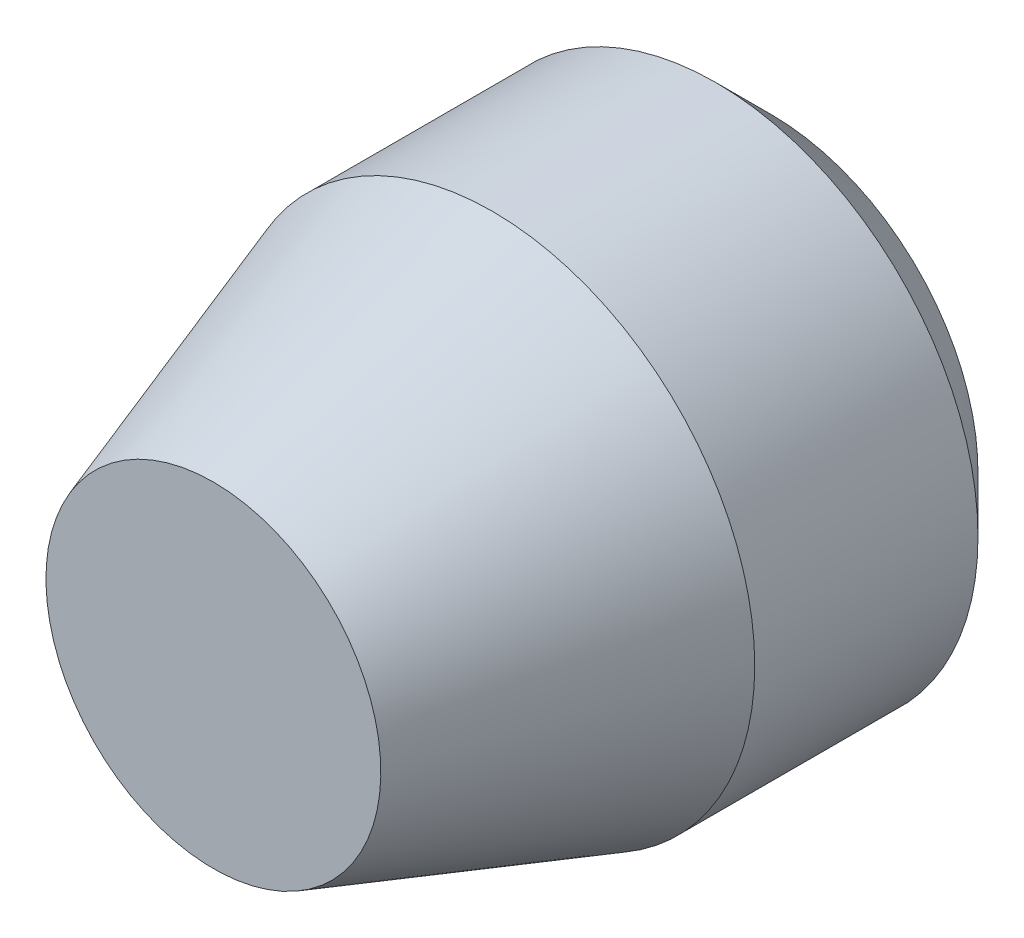
ISO-10303-21;
HEADER;
FILE_DESCRIPTION(('STEP AP214'),'2;1');
FILE_NAME('part.step','',(''),(''),'','','');
FILE_SCHEMA(('AUTOMOTIVE_DESIGN { 1 0 10303 214 1 1 1 1 }'));
ENDSEC;
DATA;
#1=APPLICATION_CONTEXT('core data for automotive mechanical design processes');
#2=APPLICATION_PROTOCOL_DEFINITION('international standard','automotive_design',2000,#1);
#3=PRODUCT_CONTEXT('',#1,'mechanical');
#4=PRODUCT('Part','Part','',(#3));
#5=PRODUCT_RELATED_PRODUCT_CATEGORY('part','',(#4));
#6=PRODUCT_DEFINITION_FORMATION('','',#4);
#7=PRODUCT_DEFINITION_CONTEXT('part definition',#1,'design');
#8=PRODUCT_DEFINITION('design','',#6,#7);
#9=PRODUCT_DEFINITION_SHAPE('','',#8);
#10=(LENGTH_UNIT() NAMED_UNIT(*) SI_UNIT(.MILLI.,.METRE.));
#11=(NAMED_UNIT(*) PLANE_ANGLE_UNIT() SI_UNIT($,.RADIAN.));
#12=(NAMED_UNIT(*) SI_UNIT($,.STERADIAN.) SOLID_ANGLE_UNIT());
#13=UNCERTAINTY_MEASURE_WITH_UNIT(LENGTH_MEASURE(1.E-05),#10,'distance_accuracy_value','');
#14=(GEOMETRIC_REPRESENTATION_CONTEXT(3) GLOBAL_UNCERTAINTY_ASSIGNED_CONTEXT((#13)) GLOBAL_UNIT_ASSIGNED_CONTEXT((#10,
#11,#12)) REPRESENTATION_CONTEXT('',''));
#15=CARTESIAN_POINT('',(0.,0.,0.));
#16=DIRECTION('',(0.,0.,1.));
#17=DIRECTION('',(1.,0.,0.));
#18=AXIS2_PLACEMENT_3D('',#15,#16,#17);
#19=CARTESIAN_POINT('',(0.,0.,0.));
#20=DIRECTION('',(0.,0.,1.));
#21=DIRECTION('',(0.,-1.,0.));
#22=AXIS2_PLACEMENT_3D('',#19,#20,#21);
#23=PLANE('',#22);
#24=CARTESIAN_POINT('',(0.,0.,0.));
#25=DIRECTION('',(0.,0.,-1.));
#26=DIRECTION('',(0.,1.,0.));
#27=AXIS2_PLACEMENT_3D('',#24,#25,#26);
#28=CIRCLE('',#27,3.);
#29=CARTESIAN_POINT('',(0.,3.,0.));
#30=VERTEX_POINT('',#29);
#31=EDGE_CURVE('E43',#30,#30,#28,.T.);
#32=ORIENTED_EDGE('',*,*,#31,.F.);
#33=EDGE_LOOP('',(#32));
#34=FACE_BOUND('',#33,.T.);
#35=ADVANCED_FACE('F32',(#34),#23,.T.);
#36=CARTESIAN_POINT('',(0.,0.,-5.));
#37=DIRECTION('',(0.,0.,-1.));
#38=DIRECTION('',(0.,1.,0.));
#39=AXIS2_PLACEMENT_3D('',#36,#37,#38);
#40=CONICAL_SURFACE('',#39,4.7,0.327738506780555);
#41=ORIENTED_EDGE('',*,*,#31,.T.);
#42=EDGE_LOOP('',(#41));
#43=FACE_BOUND('',#42,.T.);
#44=CARTESIAN_POINT('',(0.,0.,-5.));
#45=DIRECTION('',(0.,0.,-1.));
#46=DIRECTION('',(0.,1.,0.));
#47=AXIS2_PLACEMENT_3D('',#44,#45,#46);
#48=CIRCLE('',#47,4.7);
#49=CARTESIAN_POINT('',(0.,4.7,-5.));
#50=VERTEX_POINT('',#49);
#51=EDGE_CURVE('E47',#50,#50,#48,.T.);
#52=ORIENTED_EDGE('',*,*,#51,.F.);
#53=EDGE_LOOP('',(#52));
#54=FACE_BOUND('',#53,.T.);
#55=ADVANCED_FACE('F55',(#43,#54),#40,.T.);
#56=CARTESIAN_POINT('',(0.,0.,-10.));
#57=DIRECTION('',(0.,0.,-1.));
#58=DIRECTION('',(0.,1.,0.));
#59=AXIS2_PLACEMENT_3D('',#56,#57,#58);
#60=CYLINDRICAL_SURFACE('',#59,4.7);
#61=CARTESIAN_POINT('',(0.,0.,-9.00000000000001));
#62=DIRECTION('',(0.,0.,-1.));
#63=DIRECTION('',(0.,1.,0.));
#64=AXIS2_PLACEMENT_3D('',#61,#62,#63);
#65=CIRCLE('',#64,4.7);
#66=CARTESIAN_POINT('',(0.,4.7,-9.00000000000001));
#67=VERTEX_POINT('',#66);
#68=EDGE_CURVE('E10',#67,#67,#65,.F.);
#69=ORIENTED_EDGE('',*,*,#68,.T.);
#70=EDGE_LOOP('',(#69));
#71=FACE_BOUND('',#70,.T.);
#72=ORIENTED_EDGE('',*,*,#51,.T.);
#73=EDGE_LOOP('',(#72));
#74=FACE_BOUND('',#73,.T.);
#75=ADVANCED_FACE('F53',(#71,#74),#60,.T.);
#76=CARTESIAN_POINT('',(0.,4.7,-10.));
#77=DIRECTION('',(0.,0.,-1.));
#78=DIRECTION('',(0.,1.,0.));
#79=AXIS2_PLACEMENT_3D('',#76,#77,#78);
#80=PLANE('',#79);
#81=CARTESIAN_POINT('',(0.,0.,-10.));
#82=DIRECTION('',(0.,0.,-1.));
#83=DIRECTION('',(0.,1.,0.));
#84=AXIS2_PLACEMENT_3D('',#81,#82,#83);
#85=CIRCLE('',#84,3.70000000000001);
#86=CARTESIAN_POINT('',(0.,3.70000000000001,-10.));
#87=VERTEX_POINT('',#86);
#88=EDGE_CURVE('E39',#87,#87,#85,.T.);
#89=ORIENTED_EDGE('',*,*,#88,.T.);
#90=EDGE_LOOP('',(#89));
#91=FACE_BOUND('',#90,.T.);
#92=ADVANCED_FACE('F63',(#91),#80,.T.);
#93=CARTESIAN_POINT('',(0.,0.,-10.));
#94=DIRECTION('',(0.,0.,1.));
#95=DIRECTION('',(0.,-1.,0.));
#96=AXIS2_PLACEMENT_3D('',#93,#94,#95);
#97=CONICAL_SURFACE('',#96,3.70000000000001,0.785398163397446);
#98=ORIENTED_EDGE('',*,*,#68,.F.);
#99=EDGE_LOOP('',(#98));
#100=FACE_BOUND('',#99,.T.);
#101=ORIENTED_EDGE('',*,*,#88,.F.);
#102=EDGE_LOOP('',(#101));
#103=FACE_BOUND('',#102,.T.);
#104=ADVANCED_FACE('F34',(#100,#103),#97,.T.);
#105=CLOSED_SHELL('',(#35,#55,#75,#92,#104));
#106=MANIFOLD_SOLID_BREP('B2',#105);
#107=ADVANCED_BREP_SHAPE_REPRESENTATION('',(#18,#106),#14);
#108=SHAPE_DEFINITION_REPRESENTATION(#9,#107);
ENDSEC;
END-ISO-10303-21;
